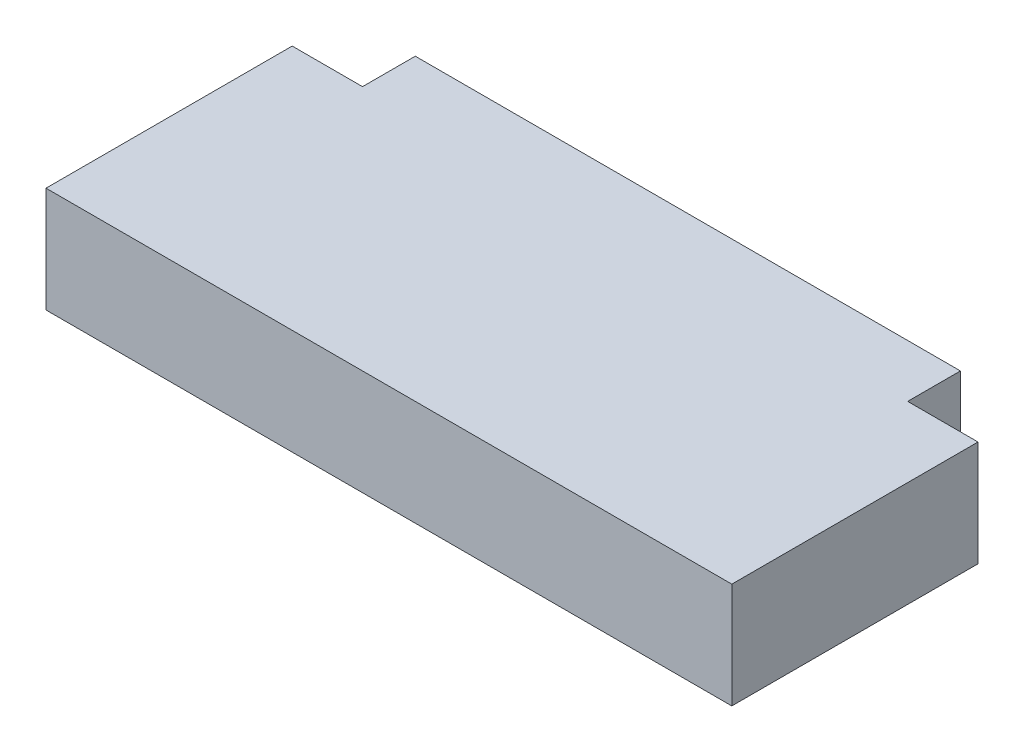
ISO-10303-21;
HEADER;
FILE_DESCRIPTION(('STEP AP214'),'2;1');
FILE_NAME('part.step','',(''),(''),'','','');
FILE_SCHEMA(('AUTOMOTIVE_DESIGN { 1 0 10303 214 1 1 1 1 }'));
ENDSEC;
DATA;
#1=APPLICATION_CONTEXT('core data for automotive mechanical design processes');
#2=APPLICATION_PROTOCOL_DEFINITION('international standard','automotive_design',2000,#1);
#3=PRODUCT_CONTEXT('',#1,'mechanical');
#4=PRODUCT('Part','Part','',(#3));
#5=PRODUCT_RELATED_PRODUCT_CATEGORY('part','',(#4));
#6=PRODUCT_DEFINITION_FORMATION('','',#4);
#7=PRODUCT_DEFINITION_CONTEXT('part definition',#1,'design');
#8=PRODUCT_DEFINITION('design','',#6,#7);
#9=PRODUCT_DEFINITION_SHAPE('','',#8);
#10=(LENGTH_UNIT() NAMED_UNIT(*) SI_UNIT(.MILLI.,.METRE.));
#11=(NAMED_UNIT(*) PLANE_ANGLE_UNIT() SI_UNIT($,.RADIAN.));
#12=(NAMED_UNIT(*) SI_UNIT($,.STERADIAN.) SOLID_ANGLE_UNIT());
#13=UNCERTAINTY_MEASURE_WITH_UNIT(LENGTH_MEASURE(1.E-05),#10,'distance_accuracy_value','');
#14=(GEOMETRIC_REPRESENTATION_CONTEXT(3) GLOBAL_UNCERTAINTY_ASSIGNED_CONTEXT((#13)) GLOBAL_UNIT_ASSIGNED_CONTEXT((#10,
#11,#12)) REPRESENTATION_CONTEXT('',''));
#15=CARTESIAN_POINT('',(0.,0.,0.));
#16=DIRECTION('',(0.,0.,1.));
#17=DIRECTION('',(1.,0.,0.));
#18=AXIS2_PLACEMENT_3D('',#15,#16,#17);
#19=CARTESIAN_POINT('',(-9.,3.,-2.44079023775156));
#20=DIRECTION('',(1.,0.,0.));
#21=DIRECTION('',(0.,0.,-1.));
#22=AXIS2_PLACEMENT_3D('',#19,#20,#21);
#23=PLANE('',#22);
#24=DIRECTION('',(0.,0.,1.));
#25=VECTOR('',#24,1.);
#26=CARTESIAN_POINT('',(-9.,3.,-2.44079023775156));
#27=LINE('',#26,#25);
#28=CARTESIAN_POINT('',(-9.,3.,-0.940790237751564));
#29=VERTEX_POINT('',#28);
#30=CARTESIAN_POINT('',(-9.,3.,6.05920976224844));
#31=VERTEX_POINT('',#30);
#32=EDGE_CURVE('E126',#29,#31,#27,.T.);
#33=ORIENTED_EDGE('',*,*,#32,.F.);
#34=DIRECTION('',(0.,1.,0.));
#35=VECTOR('',#34,1.);
#36=CARTESIAN_POINT('',(-9.,0.,-0.940790237751564));
#37=LINE('',#36,#35);
#38=CARTESIAN_POINT('',(-9.,0.,-0.940790237751564));
#39=VERTEX_POINT('',#38);
#40=EDGE_CURVE('E113',#39,#29,#37,.T.);
#41=ORIENTED_EDGE('',*,*,#40,.F.);
#42=DIRECTION('',(0.,0.,1.));
#43=VECTOR('',#42,1.);
#44=CARTESIAN_POINT('',(-9.,0.,-2.44079023775156));
#45=LINE('',#44,#43);
#46=CARTESIAN_POINT('',(-9.,0.,6.05920976224844));
#47=VERTEX_POINT('',#46);
#48=EDGE_CURVE('E124',#39,#47,#45,.T.);
#49=ORIENTED_EDGE('',*,*,#48,.T.);
#50=DIRECTION('',(0.,-1.,0.));
#51=VECTOR('',#50,1.);
#52=CARTESIAN_POINT('',(-9.,3.,6.05920976224844));
#53=LINE('',#52,#51);
#54=EDGE_CURVE('E11',#31,#47,#53,.T.);
#55=ORIENTED_EDGE('',*,*,#54,.F.);
#56=EDGE_LOOP('',(#33,#41,#49,#55));
#57=FACE_BOUND('',#56,.T.);
#58=ADVANCED_FACE('F45',(#57),#23,.F.);
#59=CARTESIAN_POINT('',(-9.,3.,6.05920976224844));
#60=DIRECTION('',(0.,0.,-1.));
#61=DIRECTION('',(-1.,0.,0.));
#62=AXIS2_PLACEMENT_3D('',#59,#60,#61);
#63=PLANE('',#62);
#64=DIRECTION('',(1.,0.,0.));
#65=VECTOR('',#64,1.);
#66=CARTESIAN_POINT('',(-9.,0.,6.05920976224844));
#67=LINE('',#66,#65);
#68=CARTESIAN_POINT('',(10.5,0.,6.05920976224844));
#69=VERTEX_POINT('',#68);
#70=EDGE_CURVE('E131',#47,#69,#67,.T.);
#71=ORIENTED_EDGE('',*,*,#70,.T.);
#72=DIRECTION('',(0.,-1.,0.));
#73=VECTOR('',#72,1.);
#74=CARTESIAN_POINT('',(10.5,3.,6.05920976224844));
#75=LINE('',#74,#73);
#76=CARTESIAN_POINT('',(10.5,3.,6.05920976224844));
#77=VERTEX_POINT('',#76);
#78=EDGE_CURVE('E53',#77,#69,#75,.T.);
#79=ORIENTED_EDGE('',*,*,#78,.F.);
#80=DIRECTION('',(1.,0.,0.));
#81=VECTOR('',#80,1.);
#82=CARTESIAN_POINT('',(-9.,3.,6.05920976224844));
#83=LINE('',#82,#81);
#84=EDGE_CURVE('E165',#31,#77,#83,.T.);
#85=ORIENTED_EDGE('',*,*,#84,.F.);
#86=ORIENTED_EDGE('',*,*,#54,.T.);
#87=EDGE_LOOP('',(#71,#79,#85,#86));
#88=FACE_BOUND('',#87,.T.);
#89=ADVANCED_FACE('F213',(#88),#63,.F.);
#90=CARTESIAN_POINT('',(10.5,3.,-2.44079023775156));
#91=DIRECTION('',(-1.,0.,0.));
#92=DIRECTION('',(0.,0.,1.));
#93=AXIS2_PLACEMENT_3D('',#90,#91,#92);
#94=PLANE('',#93);
#95=DIRECTION('',(0.,0.,-1.));
#96=VECTOR('',#95,1.);
#97=CARTESIAN_POINT('',(10.5,0.,-2.44079023775156));
#98=LINE('',#97,#96);
#99=CARTESIAN_POINT('',(10.5,0.,-0.940790237751564));
#100=VERTEX_POINT('',#99);
#101=EDGE_CURVE('E137',#69,#100,#98,.T.);
#102=ORIENTED_EDGE('',*,*,#101,.T.);
#103=DIRECTION('',(0.,1.,0.));
#104=VECTOR('',#103,1.);
#105=CARTESIAN_POINT('',(10.5,0.,-0.940790237751564));
#106=LINE('',#105,#104);
#107=CARTESIAN_POINT('',(10.5,3.,-0.940790237751564));
#108=VERTEX_POINT('',#107);
#109=EDGE_CURVE('E187',#100,#108,#106,.T.);
#110=ORIENTED_EDGE('',*,*,#109,.T.);
#111=DIRECTION('',(0.,0.,-1.));
#112=VECTOR('',#111,1.);
#113=CARTESIAN_POINT('',(10.5,3.,-2.44079023775156));
#114=LINE('',#113,#112);
#115=EDGE_CURVE('E158',#77,#108,#114,.T.);
#116=ORIENTED_EDGE('',*,*,#115,.F.);
#117=ORIENTED_EDGE('',*,*,#78,.T.);
#118=EDGE_LOOP('',(#102,#110,#116,#117));
#119=FACE_BOUND('',#118,.T.);
#120=ADVANCED_FACE('F211',(#119),#94,.F.);
#121=CARTESIAN_POINT('',(-9.,3.,-2.44079023775156));
#122=DIRECTION('',(0.,0.,1.));
#123=DIRECTION('',(1.,0.,0.));
#124=AXIS2_PLACEMENT_3D('',#121,#122,#123);
#125=PLANE('',#124);
#126=DIRECTION('',(-1.,0.,0.));
#127=VECTOR('',#126,1.);
#128=CARTESIAN_POINT('',(-9.,0.,-2.44079023775156));
#129=LINE('',#128,#127);
#130=CARTESIAN_POINT('',(8.5,0.,-2.44079023775156));
#131=VERTEX_POINT('',#130);
#132=CARTESIAN_POINT('',(-7.,0.,-2.44079023775156));
#133=VERTEX_POINT('',#132);
#134=EDGE_CURVE('E148',#131,#133,#129,.T.);
#135=ORIENTED_EDGE('',*,*,#134,.T.);
#136=DIRECTION('',(0.,1.,0.));
#137=VECTOR('',#136,1.);
#138=CARTESIAN_POINT('',(-7.,0.,-2.44079023775156));
#139=LINE('',#138,#137);
#140=CARTESIAN_POINT('',(-7.,3.,-2.44079023775156));
#141=VERTEX_POINT('',#140);
#142=EDGE_CURVE('E133',#133,#141,#139,.T.);
#143=ORIENTED_EDGE('',*,*,#142,.T.);
#144=DIRECTION('',(-1.,0.,0.));
#145=VECTOR('',#144,1.);
#146=CARTESIAN_POINT('',(-9.,3.,-2.44079023775156));
#147=LINE('',#146,#145);
#148=CARTESIAN_POINT('',(8.5,3.,-2.44079023775156));
#149=VERTEX_POINT('',#148);
#150=EDGE_CURVE('E142',#149,#141,#147,.T.);
#151=ORIENTED_EDGE('',*,*,#150,.F.);
#152=DIRECTION('',(0.,1.,0.));
#153=VECTOR('',#152,1.);
#154=CARTESIAN_POINT('',(8.5,0.,-2.44079023775156));
#155=LINE('',#154,#153);
#156=EDGE_CURVE('E179',#131,#149,#155,.T.);
#157=ORIENTED_EDGE('',*,*,#156,.F.);
#158=EDGE_LOOP('',(#135,#143,#151,#157));
#159=FACE_BOUND('',#158,.T.);
#160=ADVANCED_FACE('F206',(#159),#125,.F.);
#161=CARTESIAN_POINT('',(0.,3.,0.));
#162=DIRECTION('',(0.,1.,0.));
#163=DIRECTION('',(0.,0.,1.));
#164=AXIS2_PLACEMENT_3D('',#161,#162,#163);
#165=PLANE('',#164);
#166=DIRECTION('',(0.,0.,-1.));
#167=VECTOR('',#166,1.);
#168=CARTESIAN_POINT('',(-7.,3.,-0.940790237751564));
#169=LINE('',#168,#167);
#170=CARTESIAN_POINT('',(-7.,3.,-0.940790237751564));
#171=VERTEX_POINT('',#170);
#172=EDGE_CURVE('E119',#171,#141,#169,.T.);
#173=ORIENTED_EDGE('',*,*,#172,.F.);
#174=DIRECTION('',(1.,0.,0.));
#175=VECTOR('',#174,1.);
#176=CARTESIAN_POINT('',(-9.,3.,-0.940790237751564));
#177=LINE('',#176,#175);
#178=EDGE_CURVE('E184',#29,#171,#177,.T.);
#179=ORIENTED_EDGE('',*,*,#178,.F.);
#180=ORIENTED_EDGE('',*,*,#32,.T.);
#181=ORIENTED_EDGE('',*,*,#84,.T.);
#182=ORIENTED_EDGE('',*,*,#115,.T.);
#183=DIRECTION('',(1.,0.,0.));
#184=VECTOR('',#183,1.);
#185=CARTESIAN_POINT('',(10.5,3.,-0.940790237751564));
#186=LINE('',#185,#184);
#187=CARTESIAN_POINT('',(8.5,3.,-0.940790237751564));
#188=VERTEX_POINT('',#187);
#189=EDGE_CURVE('E176',#188,#108,#186,.T.);
#190=ORIENTED_EDGE('',*,*,#189,.F.);
#191=DIRECTION('',(0.,0.,1.));
#192=VECTOR('',#191,1.);
#193=CARTESIAN_POINT('',(8.5,3.,-2.44079023775156));
#194=LINE('',#193,#192);
#195=EDGE_CURVE('E180',#149,#188,#194,.T.);
#196=ORIENTED_EDGE('',*,*,#195,.F.);
#197=ORIENTED_EDGE('',*,*,#150,.T.);
#198=EDGE_LOOP('',(#173,#179,#180,#181,#182,#190,#196,#197));
#199=FACE_BOUND('',#198,.T.);
#200=ADVANCED_FACE('F209',(#199),#165,.T.);
#201=CARTESIAN_POINT('',(0.,0.,0.));
#202=DIRECTION('',(0.,1.,0.));
#203=DIRECTION('',(0.,0.,1.));
#204=AXIS2_PLACEMENT_3D('',#201,#202,#203);
#205=PLANE('',#204);
#206=DIRECTION('',(1.,0.,0.));
#207=VECTOR('',#206,1.);
#208=CARTESIAN_POINT('',(-9.,0.,-0.940790237751564));
#209=LINE('',#208,#207);
#210=CARTESIAN_POINT('',(-7.,0.,-0.940790237751564));
#211=VERTEX_POINT('',#210);
#212=EDGE_CURVE('E109',#39,#211,#209,.T.);
#213=ORIENTED_EDGE('',*,*,#212,.T.);
#214=DIRECTION('',(0.,0.,-1.));
#215=VECTOR('',#214,1.);
#216=CARTESIAN_POINT('',(-7.,0.,-0.940790237751564));
#217=LINE('',#216,#215);
#218=EDGE_CURVE('E60',#211,#133,#217,.T.);
#219=ORIENTED_EDGE('',*,*,#218,.T.);
#220=ORIENTED_EDGE('',*,*,#134,.F.);
#221=DIRECTION('',(0.,0.,1.));
#222=VECTOR('',#221,1.);
#223=CARTESIAN_POINT('',(8.5,0.,-2.44079023775156));
#224=LINE('',#223,#222);
#225=CARTESIAN_POINT('',(8.5,0.,-0.940790237751564));
#226=VERTEX_POINT('',#225);
#227=EDGE_CURVE('E172',#131,#226,#224,.T.);
#228=ORIENTED_EDGE('',*,*,#227,.T.);
#229=DIRECTION('',(1.,0.,0.));
#230=VECTOR('',#229,1.);
#231=CARTESIAN_POINT('',(10.5,0.,-0.940790237751564));
#232=LINE('',#231,#230);
#233=EDGE_CURVE('E68',#226,#100,#232,.T.);
#234=ORIENTED_EDGE('',*,*,#233,.T.);
#235=ORIENTED_EDGE('',*,*,#101,.F.);
#236=ORIENTED_EDGE('',*,*,#70,.F.);
#237=ORIENTED_EDGE('',*,*,#48,.F.);
#238=EDGE_LOOP('',(#213,#219,#220,#228,#234,#235,#236,#237));
#239=FACE_BOUND('',#238,.T.);
#240=ADVANCED_FACE('F129',(#239),#205,.F.);
#241=CARTESIAN_POINT('',(10.5,0.,-0.940790237751564));
#242=DIRECTION('',(0.,0.,1.));
#243=DIRECTION('',(1.,0.,0.));
#244=AXIS2_PLACEMENT_3D('',#241,#242,#243);
#245=PLANE('',#244);
#246=ORIENTED_EDGE('',*,*,#189,.T.);
#247=ORIENTED_EDGE('',*,*,#109,.F.);
#248=ORIENTED_EDGE('',*,*,#233,.F.);
#249=DIRECTION('',(0.,1.,0.));
#250=VECTOR('',#249,1.);
#251=CARTESIAN_POINT('',(8.5,0.,-0.940790237751564));
#252=LINE('',#251,#250);
#253=EDGE_CURVE('E191',#226,#188,#252,.T.);
#254=ORIENTED_EDGE('',*,*,#253,.T.);
#255=EDGE_LOOP('',(#246,#247,#248,#254));
#256=FACE_BOUND('',#255,.T.);
#257=ADVANCED_FACE('F210',(#256),#245,.F.);
#258=CARTESIAN_POINT('',(8.5,0.,-2.44079023775156));
#259=DIRECTION('',(-1.,0.,0.));
#260=DIRECTION('',(0.,0.,1.));
#261=AXIS2_PLACEMENT_3D('',#258,#259,#260);
#262=PLANE('',#261);
#263=ORIENTED_EDGE('',*,*,#195,.T.);
#264=ORIENTED_EDGE('',*,*,#253,.F.);
#265=ORIENTED_EDGE('',*,*,#227,.F.);
#266=ORIENTED_EDGE('',*,*,#156,.T.);
#267=EDGE_LOOP('',(#263,#264,#265,#266));
#268=FACE_BOUND('',#267,.T.);
#269=ADVANCED_FACE('F208',(#268),#262,.F.);
#270=CARTESIAN_POINT('',(-7.,0.,-0.940790237751564));
#271=DIRECTION('',(1.,0.,0.));
#272=DIRECTION('',(0.,0.,-1.));
#273=AXIS2_PLACEMENT_3D('',#270,#271,#272);
#274=PLANE('',#273);
#275=ORIENTED_EDGE('',*,*,#172,.T.);
#276=ORIENTED_EDGE('',*,*,#142,.F.);
#277=ORIENTED_EDGE('',*,*,#218,.F.);
#278=DIRECTION('',(0.,1.,0.));
#279=VECTOR('',#278,1.);
#280=CARTESIAN_POINT('',(-7.,0.,-0.940790237751564));
#281=LINE('',#280,#279);
#282=EDGE_CURVE('E115',#211,#171,#281,.T.);
#283=ORIENTED_EDGE('',*,*,#282,.T.);
#284=EDGE_LOOP('',(#275,#276,#277,#283));
#285=FACE_BOUND('',#284,.T.);
#286=ADVANCED_FACE('F273',(#285),#274,.F.);
#287=CARTESIAN_POINT('',(-9.,0.,-0.940790237751564));
#288=DIRECTION('',(0.,0.,1.));
#289=DIRECTION('',(1.,0.,0.));
#290=AXIS2_PLACEMENT_3D('',#287,#288,#289);
#291=PLANE('',#290);
#292=ORIENTED_EDGE('',*,*,#178,.T.);
#293=ORIENTED_EDGE('',*,*,#282,.F.);
#294=ORIENTED_EDGE('',*,*,#212,.F.);
#295=ORIENTED_EDGE('',*,*,#40,.T.);
#296=EDGE_LOOP('',(#292,#293,#294,#295));
#297=FACE_BOUND('',#296,.T.);
#298=ADVANCED_FACE('F112',(#297),#291,.F.);
#299=CLOSED_SHELL('',(#58,#89,#120,#160,#200,#240,#257,#269,#286,#298));
#300=MANIFOLD_SOLID_BREP('B2',#299);
#301=ADVANCED_BREP_SHAPE_REPRESENTATION('',(#18,#300),#14);
#302=SHAPE_DEFINITION_REPRESENTATION(#9,#301);
ENDSEC;
END-ISO-10303-21;
